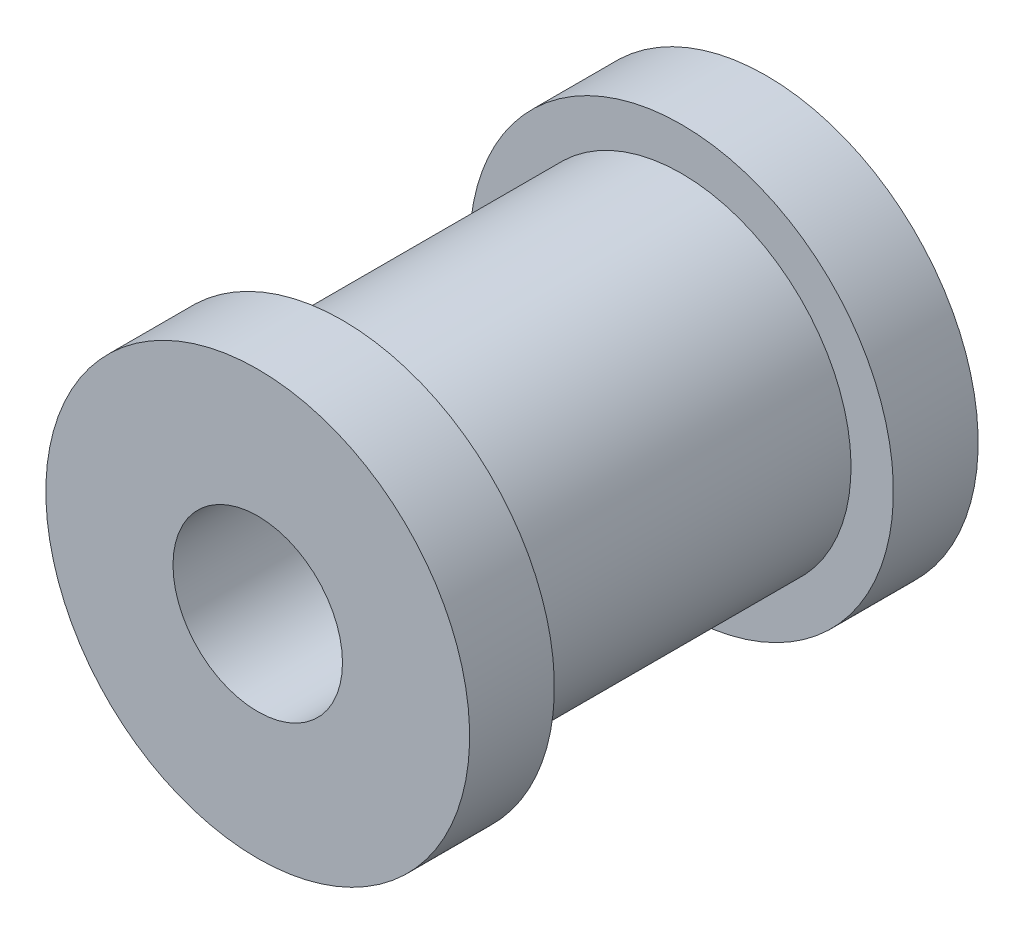
ISO-10303-21;
HEADER;
FILE_DESCRIPTION(('STEP AP214'),'2;1');
FILE_NAME('part.step','',(''),(''),'','','');
FILE_SCHEMA(('AUTOMOTIVE_DESIGN { 1 0 10303 214 1 1 1 1 }'));
ENDSEC;
DATA;
#1=APPLICATION_CONTEXT('core data for automotive mechanical design processes');
#2=APPLICATION_PROTOCOL_DEFINITION('international standard','automotive_design',2000,#1);
#3=PRODUCT_CONTEXT('',#1,'mechanical');
#4=PRODUCT('Part','Part','',(#3));
#5=PRODUCT_RELATED_PRODUCT_CATEGORY('part','',(#4));
#6=PRODUCT_DEFINITION_FORMATION('','',#4);
#7=PRODUCT_DEFINITION_CONTEXT('part definition',#1,'design');
#8=PRODUCT_DEFINITION('design','',#6,#7);
#9=PRODUCT_DEFINITION_SHAPE('','',#8);
#10=(LENGTH_UNIT() NAMED_UNIT(*) SI_UNIT(.MILLI.,.METRE.));
#11=(NAMED_UNIT(*) PLANE_ANGLE_UNIT() SI_UNIT($,.RADIAN.));
#12=(NAMED_UNIT(*) SI_UNIT($,.STERADIAN.) SOLID_ANGLE_UNIT());
#13=UNCERTAINTY_MEASURE_WITH_UNIT(LENGTH_MEASURE(1.E-05),#10,'distance_accuracy_value','');
#14=(GEOMETRIC_REPRESENTATION_CONTEXT(3) GLOBAL_UNCERTAINTY_ASSIGNED_CONTEXT((#13)) GLOBAL_UNIT_ASSIGNED_CONTEXT((#10,
#11,#12)) REPRESENTATION_CONTEXT('',''));
#15=CARTESIAN_POINT('',(0.,0.,0.));
#16=DIRECTION('',(0.,0.,1.));
#17=DIRECTION('',(1.,0.,0.));
#18=AXIS2_PLACEMENT_3D('',#15,#16,#17);
#19=CARTESIAN_POINT('',(-2155.,-5000.,15400.));
#20=DIRECTION('',(0.,0.,1.));
#21=DIRECTION('',(0.,-1.,0.));
#22=AXIS2_PLACEMENT_3D('',#19,#20,#21);
#23=CYLINDRICAL_SURFACE('',#22,500.);
#24=CARTESIAN_POINT('',(-2155.,-5000.,15600.));
#25=DIRECTION('',(0.,0.,-1.));
#26=DIRECTION('',(0.,1.,0.));
#27=AXIS2_PLACEMENT_3D('',#24,#25,#26);
#28=CIRCLE('',#27,500.);
#29=CARTESIAN_POINT('',(-2155.,-4500.,15600.));
#30=VERTEX_POINT('',#29);
#31=EDGE_CURVE('E41',#30,#30,#28,.T.);
#32=ORIENTED_EDGE('',*,*,#31,.T.);
#33=EDGE_LOOP('',(#32));
#34=FACE_BOUND('',#33,.T.);
#35=CARTESIAN_POINT('',(-2155.,-5000.,15400.));
#36=DIRECTION('',(0.,0.,-1.));
#37=DIRECTION('',(0.,1.,0.));
#38=AXIS2_PLACEMENT_3D('',#35,#36,#37);
#39=CIRCLE('',#38,500.);
#40=CARTESIAN_POINT('',(-2155.,-4500.,15400.));
#41=VERTEX_POINT('',#40);
#42=EDGE_CURVE('E10',#41,#41,#39,.T.);
#43=ORIENTED_EDGE('',*,*,#42,.F.);
#44=EDGE_LOOP('',(#43));
#45=FACE_BOUND('',#44,.T.);
#46=ADVANCED_FACE('F35',(#34,#45),#23,.T.);
#47=CARTESIAN_POINT('',(-2155.,-5000.,15400.));
#48=DIRECTION('',(0.,0.,-1.));
#49=DIRECTION('',(0.,1.,0.));
#50=AXIS2_PLACEMENT_3D('',#47,#48,#49);
#51=PLANE('',#50);
#52=CARTESIAN_POINT('',(-2155.,-5000.,15400.));
#53=DIRECTION('',(0.,0.,-1.));
#54=DIRECTION('',(0.,1.,0.));
#55=AXIS2_PLACEMENT_3D('',#52,#53,#54);
#56=CIRCLE('',#55,200.);
#57=CARTESIAN_POINT('',(-2155.,-4800.,15400.));
#58=VERTEX_POINT('',#57);
#59=EDGE_CURVE('E49',#58,#58,#56,.T.);
#60=ORIENTED_EDGE('',*,*,#59,.F.);
#61=EDGE_LOOP('',(#60));
#62=FACE_BOUND('',#61,.T.);
#63=ORIENTED_EDGE('',*,*,#42,.T.);
#64=EDGE_LOOP('',(#63));
#65=FACE_BOUND('',#64,.T.);
#66=ADVANCED_FACE('F86',(#62,#65),#51,.T.);
#67=CARTESIAN_POINT('',(-2155.,-5000.,15600.));
#68=DIRECTION('',(0.,0.,1.));
#69=DIRECTION('',(0.,-1.,0.));
#70=AXIS2_PLACEMENT_3D('',#67,#68,#69);
#71=CYLINDRICAL_SURFACE('',#70,400.);
#72=CARTESIAN_POINT('',(-2155.,-5000.,15600.));
#73=DIRECTION('',(0.,0.,-1.));
#74=DIRECTION('',(0.,1.,0.));
#75=AXIS2_PLACEMENT_3D('',#72,#73,#74);
#76=CIRCLE('',#75,400.);
#77=CARTESIAN_POINT('',(-2155.,-4600.,15600.));
#78=VERTEX_POINT('',#77);
#79=EDGE_CURVE('E45',#78,#78,#76,.T.);
#80=ORIENTED_EDGE('',*,*,#79,.F.);
#81=EDGE_LOOP('',(#80));
#82=FACE_BOUND('',#81,.T.);
#83=CARTESIAN_POINT('',(-2155.,-5000.,16400.));
#84=DIRECTION('',(0.,0.,-1.));
#85=DIRECTION('',(0.,1.,0.));
#86=AXIS2_PLACEMENT_3D('',#83,#84,#85);
#87=CIRCLE('',#86,400.);
#88=CARTESIAN_POINT('',(-2155.,-4600.,16400.));
#89=VERTEX_POINT('',#88);
#90=EDGE_CURVE('E60',#89,#89,#87,.T.);
#91=ORIENTED_EDGE('',*,*,#90,.T.);
#92=EDGE_LOOP('',(#91));
#93=FACE_BOUND('',#92,.T.);
#94=ADVANCED_FACE('F82',(#82,#93),#71,.T.);
#95=CARTESIAN_POINT('',(0.,2.55116222717141E-11,15600.));
#96=DIRECTION('',(0.,0.,-1.));
#97=DIRECTION('',(0.,1.,0.));
#98=AXIS2_PLACEMENT_3D('',#95,#96,#97);
#99=PLANE('',#98);
#100=ORIENTED_EDGE('',*,*,#79,.T.);
#101=EDGE_LOOP('',(#100));
#102=FACE_BOUND('',#101,.T.);
#103=ORIENTED_EDGE('',*,*,#31,.F.);
#104=EDGE_LOOP('',(#103));
#105=FACE_BOUND('',#104,.T.);
#106=ADVANCED_FACE('F73',(#102,#105),#99,.F.);
#107=CARTESIAN_POINT('',(-2155.,-5000.,13999.999));
#108=DIRECTION('',(0.,0.,1.));
#109=DIRECTION('',(0.,-1.,0.));
#110=AXIS2_PLACEMENT_3D('',#107,#108,#109);
#111=CYLINDRICAL_SURFACE('',#110,200.);
#112=ORIENTED_EDGE('',*,*,#59,.T.);
#113=EDGE_LOOP('',(#112));
#114=FACE_BOUND('',#113,.T.);
#115=CARTESIAN_POINT('',(-2155.,-5000.,16600.));
#116=DIRECTION('',(0.,0.,-1.));
#117=DIRECTION('',(0.,1.,0.));
#118=AXIS2_PLACEMENT_3D('',#115,#116,#117);
#119=CIRCLE('',#118,200.);
#120=CARTESIAN_POINT('',(-2155.,-4800.,16600.));
#121=VERTEX_POINT('',#120);
#122=EDGE_CURVE('E63',#121,#121,#119,.T.);
#123=ORIENTED_EDGE('',*,*,#122,.F.);
#124=EDGE_LOOP('',(#123));
#125=FACE_BOUND('',#124,.T.);
#126=ADVANCED_FACE('F70',(#114,#125),#111,.F.);
#127=CARTESIAN_POINT('',(-2155.,-5000.,16600.));
#128=DIRECTION('',(0.,0.,-1.));
#129=DIRECTION('',(0.,-1.,0.));
#130=AXIS2_PLACEMENT_3D('',#127,#128,#129);
#131=CYLINDRICAL_SURFACE('',#130,500.);
#132=CARTESIAN_POINT('',(-2155.,-5000.,16400.));
#133=DIRECTION('',(0.,0.,-1.));
#134=DIRECTION('',(0.,1.,0.));
#135=AXIS2_PLACEMENT_3D('',#132,#133,#134);
#136=CIRCLE('',#135,500.);
#137=CARTESIAN_POINT('',(-2155.,-4500.,16400.));
#138=VERTEX_POINT('',#137);
#139=EDGE_CURVE('E57',#138,#138,#136,.T.);
#140=ORIENTED_EDGE('',*,*,#139,.F.);
#141=EDGE_LOOP('',(#140));
#142=FACE_BOUND('',#141,.T.);
#143=CARTESIAN_POINT('',(-2155.,-5000.,16600.));
#144=DIRECTION('',(0.,0.,-1.));
#145=DIRECTION('',(0.,1.,0.));
#146=AXIS2_PLACEMENT_3D('',#143,#144,#145);
#147=CIRCLE('',#146,500.);
#148=CARTESIAN_POINT('',(-2155.,-4500.,16600.));
#149=VERTEX_POINT('',#148);
#150=EDGE_CURVE('E54',#149,#149,#147,.T.);
#151=ORIENTED_EDGE('',*,*,#150,.T.);
#152=EDGE_LOOP('',(#151));
#153=FACE_BOUND('',#152,.T.);
#154=ADVANCED_FACE('F72',(#142,#153),#131,.T.);
#155=CARTESIAN_POINT('',(-2155.,-5000.,16600.));
#156=DIRECTION('',(0.,0.,1.));
#157=DIRECTION('',(0.,1.,0.));
#158=AXIS2_PLACEMENT_3D('',#155,#156,#157);
#159=PLANE('',#158);
#160=ORIENTED_EDGE('',*,*,#122,.T.);
#161=EDGE_LOOP('',(#160));
#162=FACE_BOUND('',#161,.T.);
#163=ORIENTED_EDGE('',*,*,#150,.F.);
#164=EDGE_LOOP('',(#163));
#165=FACE_BOUND('',#164,.T.);
#166=ADVANCED_FACE('F67',(#162,#165),#159,.T.);
#167=CARTESIAN_POINT('',(0.,2.61575702133142E-11,16400.));
#168=DIRECTION('',(0.,0.,1.));
#169=DIRECTION('',(0.,1.,0.));
#170=AXIS2_PLACEMENT_3D('',#167,#168,#169);
#171=PLANE('',#170);
#172=ORIENTED_EDGE('',*,*,#90,.F.);
#173=EDGE_LOOP('',(#172));
#174=FACE_BOUND('',#173,.T.);
#175=ORIENTED_EDGE('',*,*,#139,.T.);
#176=EDGE_LOOP('',(#175));
#177=FACE_BOUND('',#176,.T.);
#178=ADVANCED_FACE('F104',(#174,#177),#171,.F.);
#179=CLOSED_SHELL('',(#46,#66,#94,#106,#126,#154,#166,#178));
#180=MANIFOLD_SOLID_BREP('B2',#179);
#181=ADVANCED_BREP_SHAPE_REPRESENTATION('',(#18,#180),#14);
#182=SHAPE_DEFINITION_REPRESENTATION(#9,#181);
ENDSEC;
END-ISO-10303-21;
